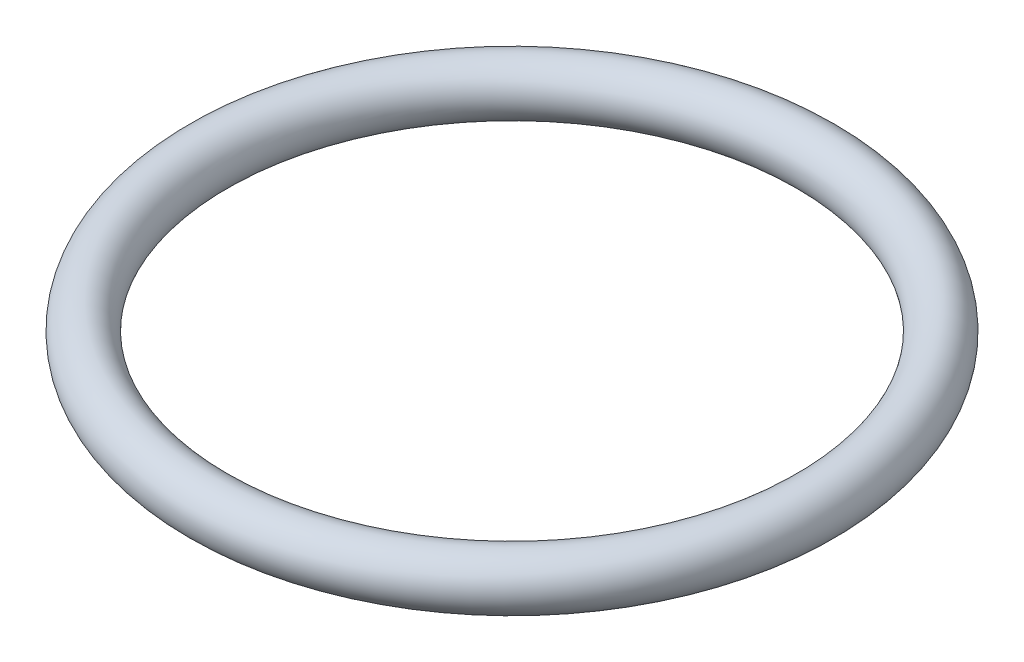
ISO-10303-21;
HEADER;
FILE_DESCRIPTION(('STEP AP214'),'2;1');
FILE_NAME('part.step','',(''),(''),'','','');
FILE_SCHEMA(('AUTOMOTIVE_DESIGN { 1 0 10303 214 1 1 1 1 }'));
ENDSEC;
DATA;
#1=APPLICATION_CONTEXT('core data for automotive mechanical design processes');
#2=APPLICATION_PROTOCOL_DEFINITION('international standard','automotive_design',2000,#1);
#3=PRODUCT_CONTEXT('',#1,'mechanical');
#4=PRODUCT('Part','Part','',(#3));
#5=PRODUCT_RELATED_PRODUCT_CATEGORY('part','',(#4));
#6=PRODUCT_DEFINITION_FORMATION('','',#4);
#7=PRODUCT_DEFINITION_CONTEXT('part definition',#1,'design');
#8=PRODUCT_DEFINITION('design','',#6,#7);
#9=PRODUCT_DEFINITION_SHAPE('','',#8);
#10=(LENGTH_UNIT() NAMED_UNIT(*) SI_UNIT(.MILLI.,.METRE.));
#11=(NAMED_UNIT(*) PLANE_ANGLE_UNIT() SI_UNIT($,.RADIAN.));
#12=(NAMED_UNIT(*) SI_UNIT($,.STERADIAN.) SOLID_ANGLE_UNIT());
#13=UNCERTAINTY_MEASURE_WITH_UNIT(LENGTH_MEASURE(1.E-05),#10,'distance_accuracy_value','');
#14=(GEOMETRIC_REPRESENTATION_CONTEXT(3) GLOBAL_UNCERTAINTY_ASSIGNED_CONTEXT((#13)) GLOBAL_UNIT_ASSIGNED_CONTEXT((#10,
#11,#12)) REPRESENTATION_CONTEXT('',''));
#15=CARTESIAN_POINT('',(0.,0.,0.));
#16=DIRECTION('',(0.,0.,1.));
#17=DIRECTION('',(1.,0.,0.));
#18=AXIS2_PLACEMENT_3D('',#15,#16,#17);
#19=CARTESIAN_POINT('',(0.,0.,0.));
#20=DIRECTION('',(0.,1.,0.));
#21=DIRECTION('',(0.,0.,1.));
#22=AXIS2_PLACEMENT_3D('',#19,#20,#21);
#23=TOROIDAL_SURFACE('',#22,6.9,0.6);
#24=CARTESIAN_POINT('',(0.,0.,6.9));
#25=DIRECTION('',(1.,0.,0.));
#26=DIRECTION('',(0.,0.,-1.));
#27=AXIS2_PLACEMENT_3D('',#24,#25,#26);
#28=CIRCLE('',#27,0.6);
#29=CARTESIAN_POINT('',(0.,0.,7.5));
#30=VERTEX_POINT('',#29);
#31=EDGE_CURVE('E11',#30,#30,#28,.T.);
#32=CARTESIAN_POINT('',(0.,0.,0.));
#33=DIRECTION('',(0.,1.,0.));
#34=DIRECTION('',(0.,0.,1.));
#35=AXIS2_PLACEMENT_3D('',#32,#33,#34);
#36=CIRCLE('',#35,7.5);
#37=EDGE_CURVE('',#30,#30,#36,.T.);
#38=ORIENTED_EDGE('',*,*,#31,.T.);
#39=ORIENTED_EDGE('',*,*,#31,.F.);
#40=ORIENTED_EDGE('',*,*,#37,.T.);
#41=ORIENTED_EDGE('',*,*,#37,.F.);
#42=EDGE_LOOP('',(#38,#40,#39,#41));
#43=FACE_BOUND('',#42,.T.);
#44=ADVANCED_FACE('F49',(#43),#23,.T.);
#45=CLOSED_SHELL('',(#44));
#46=MANIFOLD_SOLID_BREP('B2',#45);
#47=ADVANCED_BREP_SHAPE_REPRESENTATION('',(#18,#46),#14);
#48=SHAPE_DEFINITION_REPRESENTATION(#9,#47);
ENDSEC;
END-ISO-10303-21;
